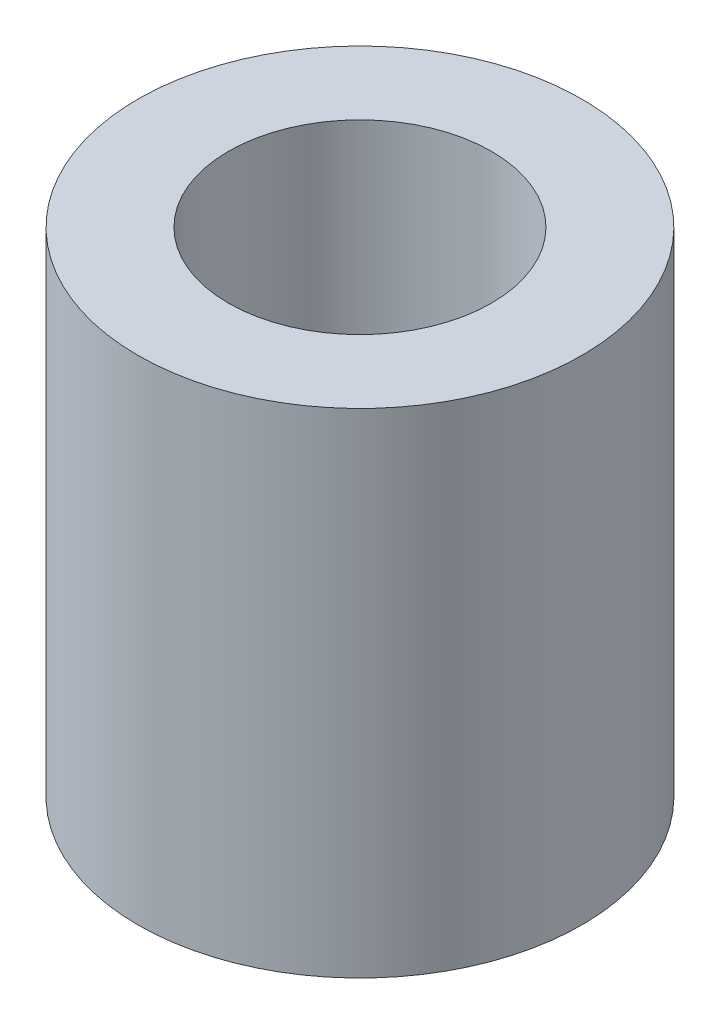
ISO-10303-21;
HEADER;
FILE_DESCRIPTION(('STEP AP214'),'2;1');
FILE_NAME('part.step','',(''),(''),'','','');
FILE_SCHEMA(('AUTOMOTIVE_DESIGN { 1 0 10303 214 1 1 1 1 }'));
ENDSEC;
DATA;
#1=APPLICATION_CONTEXT('core data for automotive mechanical design processes');
#2=APPLICATION_PROTOCOL_DEFINITION('international standard','automotive_design',2000,#1);
#3=PRODUCT_CONTEXT('',#1,'mechanical');
#4=PRODUCT('Part','Part','',(#3));
#5=PRODUCT_RELATED_PRODUCT_CATEGORY('part','',(#4));
#6=PRODUCT_DEFINITION_FORMATION('','',#4);
#7=PRODUCT_DEFINITION_CONTEXT('part definition',#1,'design');
#8=PRODUCT_DEFINITION('design','',#6,#7);
#9=PRODUCT_DEFINITION_SHAPE('','',#8);
#10=(LENGTH_UNIT() NAMED_UNIT(*) SI_UNIT(.MILLI.,.METRE.));
#11=(NAMED_UNIT(*) PLANE_ANGLE_UNIT() SI_UNIT($,.RADIAN.));
#12=(NAMED_UNIT(*) SI_UNIT($,.STERADIAN.) SOLID_ANGLE_UNIT());
#13=UNCERTAINTY_MEASURE_WITH_UNIT(LENGTH_MEASURE(1.E-05),#10,'distance_accuracy_value','');
#14=(GEOMETRIC_REPRESENTATION_CONTEXT(3) GLOBAL_UNCERTAINTY_ASSIGNED_CONTEXT((#13)) GLOBAL_UNIT_ASSIGNED_CONTEXT((#10,
#11,#12)) REPRESENTATION_CONTEXT('',''));
#15=CARTESIAN_POINT('',(0.,0.,0.));
#16=DIRECTION('',(0.,0.,1.));
#17=DIRECTION('',(1.,0.,0.));
#18=AXIS2_PLACEMENT_3D('',#15,#16,#17);
#19=CARTESIAN_POINT('',(0.,3.75,0.));
#20=DIRECTION('',(0.,1.,0.));
#21=DIRECTION('',(0.,0.,1.));
#22=AXIS2_PLACEMENT_3D('',#19,#20,#21);
#23=PLANE('',#22);
#24=CARTESIAN_POINT('',(0.,3.75,0.));
#25=DIRECTION('',(0.,1.,0.));
#26=DIRECTION('',(0.,0.,1.));
#27=AXIS2_PLACEMENT_3D('',#24,#25,#26);
#28=CIRCLE('',#27,3.375);
#29=CARTESIAN_POINT('',(0.,3.75,3.375));
#30=VERTEX_POINT('',#29);
#31=EDGE_CURVE('E10',#30,#30,#28,.T.);
#32=ORIENTED_EDGE('',*,*,#31,.T.);
#33=EDGE_LOOP('',(#32));
#34=FACE_BOUND('',#33,.T.);
#35=CARTESIAN_POINT('',(0.,3.75,0.));
#36=DIRECTION('',(0.,1.,0.));
#37=DIRECTION('',(0.,0.,1.));
#38=AXIS2_PLACEMENT_3D('',#35,#36,#37);
#39=CIRCLE('',#38,2.);
#40=CARTESIAN_POINT('',(0.,3.75,2.));
#41=VERTEX_POINT('',#40);
#42=EDGE_CURVE('E54',#41,#41,#39,.T.);
#43=ORIENTED_EDGE('',*,*,#42,.F.);
#44=EDGE_LOOP('',(#43));
#45=FACE_BOUND('',#44,.T.);
#46=ADVANCED_FACE('F41',(#34,#45),#23,.T.);
#47=CARTESIAN_POINT('',(0.,-3.75,0.));
#48=DIRECTION('',(0.,1.,0.));
#49=DIRECTION('',(0.,0.,1.));
#50=AXIS2_PLACEMENT_3D('',#47,#48,#49);
#51=PLANE('',#50);
#52=CARTESIAN_POINT('',(0.,-3.75,0.));
#53=DIRECTION('',(0.,1.,0.));
#54=DIRECTION('',(0.,0.,1.));
#55=AXIS2_PLACEMENT_3D('',#52,#53,#54);
#56=CIRCLE('',#55,3.375);
#57=CARTESIAN_POINT('',(0.,-3.75,3.375));
#58=VERTEX_POINT('',#57);
#59=EDGE_CURVE('E45',#58,#58,#56,.T.);
#60=ORIENTED_EDGE('',*,*,#59,.F.);
#61=EDGE_LOOP('',(#60));
#62=FACE_BOUND('',#61,.T.);
#63=CARTESIAN_POINT('',(0.,-3.75,0.));
#64=DIRECTION('',(0.,1.,0.));
#65=DIRECTION('',(0.,0.,1.));
#66=AXIS2_PLACEMENT_3D('',#63,#64,#65);
#67=CIRCLE('',#66,2.);
#68=CARTESIAN_POINT('',(0.,-3.75,2.));
#69=VERTEX_POINT('',#68);
#70=EDGE_CURVE('E56',#69,#69,#67,.T.);
#71=ORIENTED_EDGE('',*,*,#70,.T.);
#72=EDGE_LOOP('',(#71));
#73=FACE_BOUND('',#72,.T.);
#74=ADVANCED_FACE('F68',(#62,#73),#51,.F.);
#75=CARTESIAN_POINT('',(0.,3.75,0.));
#76=DIRECTION('',(0.,-1.,0.));
#77=DIRECTION('',(0.,0.,-1.));
#78=AXIS2_PLACEMENT_3D('',#75,#76,#77);
#79=CYLINDRICAL_SURFACE('',#78,3.375);
#80=ORIENTED_EDGE('',*,*,#31,.F.);
#81=EDGE_LOOP('',(#80));
#82=FACE_BOUND('',#81,.T.);
#83=ORIENTED_EDGE('',*,*,#59,.T.);
#84=EDGE_LOOP('',(#83));
#85=FACE_BOUND('',#84,.T.);
#86=ADVANCED_FACE('F43',(#82,#85),#79,.T.);
#87=CARTESIAN_POINT('',(0.,3.75,0.));
#88=DIRECTION('',(0.,-1.,0.));
#89=DIRECTION('',(0.,0.,-1.));
#90=AXIS2_PLACEMENT_3D('',#87,#88,#89);
#91=CYLINDRICAL_SURFACE('',#90,2.);
#92=ORIENTED_EDGE('',*,*,#42,.T.);
#93=EDGE_LOOP('',(#92));
#94=FACE_BOUND('',#93,.T.);
#95=ORIENTED_EDGE('',*,*,#70,.F.);
#96=EDGE_LOOP('',(#95));
#97=FACE_BOUND('',#96,.T.);
#98=ADVANCED_FACE('F64',(#94,#97),#91,.F.);
#99=CLOSED_SHELL('',(#46,#74,#86,#98));
#100=MANIFOLD_SOLID_BREP('B2',#99);
#101=ADVANCED_BREP_SHAPE_REPRESENTATION('',(#18,#100),#14);
#102=SHAPE_DEFINITION_REPRESENTATION(#9,#101);
ENDSEC;
END-ISO-10303-21;
